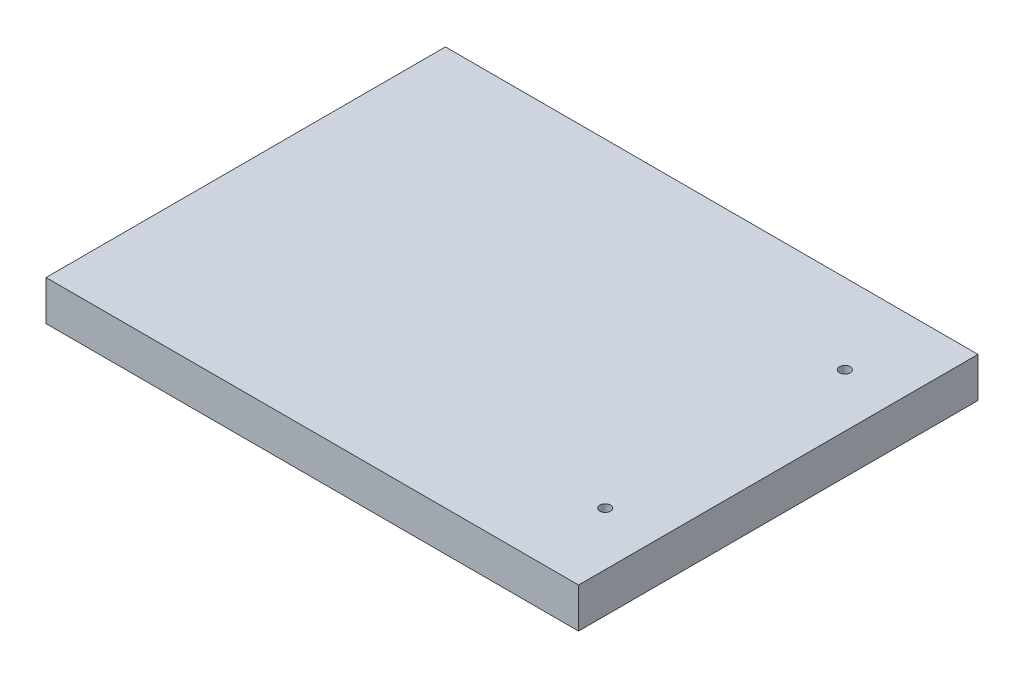
ISO-10303-21;
HEADER;
FILE_DESCRIPTION(('STEP AP214'),'2;1');
FILE_NAME('part.step','',(''),(''),'','','');
FILE_SCHEMA(('AUTOMOTIVE_DESIGN { 1 0 10303 214 1 1 1 1 }'));
ENDSEC;
DATA;
#1=APPLICATION_CONTEXT('core data for automotive mechanical design processes');
#2=APPLICATION_PROTOCOL_DEFINITION('international standard','automotive_design',2000,#1);
#3=PRODUCT_CONTEXT('',#1,'mechanical');
#4=PRODUCT('Part','Part','',(#3));
#5=PRODUCT_RELATED_PRODUCT_CATEGORY('part','',(#4));
#6=PRODUCT_DEFINITION_FORMATION('','',#4);
#7=PRODUCT_DEFINITION_CONTEXT('part definition',#1,'design');
#8=PRODUCT_DEFINITION('design','',#6,#7);
#9=PRODUCT_DEFINITION_SHAPE('','',#8);
#10=(LENGTH_UNIT() NAMED_UNIT(*) SI_UNIT(.MILLI.,.METRE.));
#11=(NAMED_UNIT(*) PLANE_ANGLE_UNIT() SI_UNIT($,.RADIAN.));
#12=(NAMED_UNIT(*) SI_UNIT($,.STERADIAN.) SOLID_ANGLE_UNIT());
#13=UNCERTAINTY_MEASURE_WITH_UNIT(LENGTH_MEASURE(1.E-05),#10,'distance_accuracy_value','');
#14=(GEOMETRIC_REPRESENTATION_CONTEXT(3) GLOBAL_UNCERTAINTY_ASSIGNED_CONTEXT((#13)) GLOBAL_UNIT_ASSIGNED_CONTEXT((#10,
#11,#12)) REPRESENTATION_CONTEXT('',''));
#15=CARTESIAN_POINT('',(0.,0.,0.));
#16=DIRECTION('',(0.,0.,1.));
#17=DIRECTION('',(1.,0.,0.));
#18=AXIS2_PLACEMENT_3D('',#15,#16,#17);
#19=CARTESIAN_POINT('',(0.,15.,0.));
#20=DIRECTION('',(1.,0.,0.));
#21=DIRECTION('',(0.,0.,-1.));
#22=AXIS2_PLACEMENT_3D('',#19,#20,#21);
#23=PLANE('',#22);
#24=DIRECTION('',(0.,0.,1.));
#25=VECTOR('',#24,1.);
#26=CARTESIAN_POINT('',(0.,0.,0.));
#27=LINE('',#26,#25);
#28=CARTESIAN_POINT('',(0.,0.,-150.));
#29=VERTEX_POINT('',#28);
#30=CARTESIAN_POINT('',(0.,0.,0.));
#31=VERTEX_POINT('',#30);
#32=EDGE_CURVE('E114',#29,#31,#27,.T.);
#33=ORIENTED_EDGE('',*,*,#32,.T.);
#34=DIRECTION('',(0.,-1.,0.));
#35=VECTOR('',#34,1.);
#36=CARTESIAN_POINT('',(0.,15.,0.));
#37=LINE('',#36,#35);
#38=CARTESIAN_POINT('',(0.,15.,0.));
#39=VERTEX_POINT('',#38);
#40=EDGE_CURVE('E11',#39,#31,#37,.T.);
#41=ORIENTED_EDGE('',*,*,#40,.F.);
#42=DIRECTION('',(0.,0.,1.));
#43=VECTOR('',#42,1.);
#44=CARTESIAN_POINT('',(0.,15.,0.));
#45=LINE('',#44,#43);
#46=CARTESIAN_POINT('',(0.,15.,-150.));
#47=VERTEX_POINT('',#46);
#48=EDGE_CURVE('E115',#47,#39,#45,.T.);
#49=ORIENTED_EDGE('',*,*,#48,.F.);
#50=DIRECTION('',(0.,-1.,0.));
#51=VECTOR('',#50,1.);
#52=CARTESIAN_POINT('',(0.,15.,-150.));
#53=LINE('',#52,#51);
#54=EDGE_CURVE('E121',#47,#29,#53,.T.);
#55=ORIENTED_EDGE('',*,*,#54,.T.);
#56=EDGE_LOOP('',(#33,#41,#49,#55));
#57=FACE_BOUND('',#56,.T.);
#58=ADVANCED_FACE('F39',(#57),#23,.F.);
#59=CARTESIAN_POINT('',(0.,15.,0.));
#60=DIRECTION('',(0.,0.,-1.));
#61=DIRECTION('',(-1.,0.,0.));
#62=AXIS2_PLACEMENT_3D('',#59,#60,#61);
#63=PLANE('',#62);
#64=DIRECTION('',(1.,0.,0.));
#65=VECTOR('',#64,1.);
#66=CARTESIAN_POINT('',(0.,0.,0.));
#67=LINE('',#66,#65);
#68=CARTESIAN_POINT('',(200.,0.,0.));
#69=VERTEX_POINT('',#68);
#70=EDGE_CURVE('E124',#31,#69,#67,.T.);
#71=ORIENTED_EDGE('',*,*,#70,.T.);
#72=DIRECTION('',(0.,-1.,0.));
#73=VECTOR('',#72,1.);
#74=CARTESIAN_POINT('',(200.,15.,0.));
#75=LINE('',#74,#73);
#76=CARTESIAN_POINT('',(200.,15.,0.));
#77=VERTEX_POINT('',#76);
#78=EDGE_CURVE('E47',#77,#69,#75,.T.);
#79=ORIENTED_EDGE('',*,*,#78,.F.);
#80=DIRECTION('',(1.,0.,0.));
#81=VECTOR('',#80,1.);
#82=CARTESIAN_POINT('',(0.,15.,0.));
#83=LINE('',#82,#81);
#84=EDGE_CURVE('E86',#39,#77,#83,.T.);
#85=ORIENTED_EDGE('',*,*,#84,.F.);
#86=ORIENTED_EDGE('',*,*,#40,.T.);
#87=EDGE_LOOP('',(#71,#79,#85,#86));
#88=FACE_BOUND('',#87,.T.);
#89=ADVANCED_FACE('F149',(#88),#63,.F.);
#90=CARTESIAN_POINT('',(200.,15.,0.));
#91=DIRECTION('',(-1.,0.,0.));
#92=DIRECTION('',(0.,0.,1.));
#93=AXIS2_PLACEMENT_3D('',#90,#91,#92);
#94=PLANE('',#93);
#95=DIRECTION('',(0.,0.,-1.));
#96=VECTOR('',#95,1.);
#97=CARTESIAN_POINT('',(200.,0.,0.));
#98=LINE('',#97,#96);
#99=CARTESIAN_POINT('',(200.,0.,-150.));
#100=VERTEX_POINT('',#99);
#101=EDGE_CURVE('E73',#69,#100,#98,.T.);
#102=ORIENTED_EDGE('',*,*,#101,.T.);
#103=DIRECTION('',(0.,-1.,0.));
#104=VECTOR('',#103,1.);
#105=CARTESIAN_POINT('',(200.,15.,-150.));
#106=LINE('',#105,#104);
#107=CARTESIAN_POINT('',(200.,15.,-150.));
#108=VERTEX_POINT('',#107);
#109=EDGE_CURVE('E129',#108,#100,#106,.T.);
#110=ORIENTED_EDGE('',*,*,#109,.F.);
#111=DIRECTION('',(0.,0.,-1.));
#112=VECTOR('',#111,1.);
#113=CARTESIAN_POINT('',(200.,15.,0.));
#114=LINE('',#113,#112);
#115=EDGE_CURVE('E118',#77,#108,#114,.T.);
#116=ORIENTED_EDGE('',*,*,#115,.F.);
#117=ORIENTED_EDGE('',*,*,#78,.T.);
#118=EDGE_LOOP('',(#102,#110,#116,#117));
#119=FACE_BOUND('',#118,.T.);
#120=ADVANCED_FACE('F131',(#119),#94,.F.);
#121=CARTESIAN_POINT('',(0.,15.,-150.));
#122=DIRECTION('',(0.,0.,1.));
#123=DIRECTION('',(1.,0.,0.));
#124=AXIS2_PLACEMENT_3D('',#121,#122,#123);
#125=PLANE('',#124);
#126=DIRECTION('',(-1.,0.,0.));
#127=VECTOR('',#126,1.);
#128=CARTESIAN_POINT('',(0.,0.,-150.));
#129=LINE('',#128,#127);
#130=EDGE_CURVE('E79',#100,#29,#129,.T.);
#131=ORIENTED_EDGE('',*,*,#130,.T.);
#132=ORIENTED_EDGE('',*,*,#54,.F.);
#133=DIRECTION('',(-1.,0.,0.));
#134=VECTOR('',#133,1.);
#135=CARTESIAN_POINT('',(0.,15.,-150.));
#136=LINE('',#135,#134);
#137=EDGE_CURVE('E55',#108,#47,#136,.T.);
#138=ORIENTED_EDGE('',*,*,#137,.F.);
#139=ORIENTED_EDGE('',*,*,#109,.T.);
#140=EDGE_LOOP('',(#131,#132,#138,#139));
#141=FACE_BOUND('',#140,.T.);
#142=ADVANCED_FACE('F138',(#141),#125,.F.);
#143=CARTESIAN_POINT('',(0.,15.,0.));
#144=DIRECTION('',(0.,-1.,0.));
#145=DIRECTION('',(0.,0.,-1.));
#146=AXIS2_PLACEMENT_3D('',#143,#144,#145);
#147=PLANE('',#146);
#148=CARTESIAN_POINT('',(180.,15.,-120.));
#149=DIRECTION('',(0.,1.,0.));
#150=DIRECTION('',(0.,0.,1.));
#151=AXIS2_PLACEMENT_3D('',#148,#149,#150);
#152=CIRCLE('',#151,2.);
#153=CARTESIAN_POINT('',(180.,15.,-118.));
#154=VERTEX_POINT('',#153);
#155=EDGE_CURVE('E104',#154,#154,#152,.T.);
#156=ORIENTED_EDGE('',*,*,#155,.F.);
#157=EDGE_LOOP('',(#156));
#158=FACE_BOUND('',#157,.T.);
#159=CARTESIAN_POINT('',(180.,15.,-30.));
#160=DIRECTION('',(0.,1.,0.));
#161=DIRECTION('',(0.,0.,1.));
#162=AXIS2_PLACEMENT_3D('',#159,#160,#161);
#163=CIRCLE('',#162,2.);
#164=CARTESIAN_POINT('',(180.,15.,-28.));
#165=VERTEX_POINT('',#164);
#166=EDGE_CURVE('E103',#165,#165,#163,.T.);
#167=ORIENTED_EDGE('',*,*,#166,.F.);
#168=EDGE_LOOP('',(#167));
#169=FACE_BOUND('',#168,.T.);
#170=ORIENTED_EDGE('',*,*,#48,.T.);
#171=ORIENTED_EDGE('',*,*,#84,.T.);
#172=ORIENTED_EDGE('',*,*,#115,.T.);
#173=ORIENTED_EDGE('',*,*,#137,.T.);
#174=EDGE_LOOP('',(#170,#171,#172,#173));
#175=FACE_BOUND('',#174,.T.);
#176=ADVANCED_FACE('F140',(#158,#169,#175),#147,.F.);
#177=CARTESIAN_POINT('',(0.,0.,0.));
#178=DIRECTION('',(0.,-1.,0.));
#179=DIRECTION('',(0.,0.,-1.));
#180=AXIS2_PLACEMENT_3D('',#177,#178,#179);
#181=PLANE('',#180);
#182=ORIENTED_EDGE('',*,*,#32,.F.);
#183=ORIENTED_EDGE('',*,*,#130,.F.);
#184=ORIENTED_EDGE('',*,*,#101,.F.);
#185=ORIENTED_EDGE('',*,*,#70,.F.);
#186=EDGE_LOOP('',(#182,#183,#184,#185));
#187=FACE_BOUND('',#186,.T.);
#188=ADVANCED_FACE('F134',(#187),#181,.T.);
#189=CARTESIAN_POINT('',(180.,9.5,-30.));
#190=DIRECTION('',(0.,1.,0.));
#191=DIRECTION('',(0.,0.,1.));
#192=AXIS2_PLACEMENT_3D('',#189,#190,#191);
#193=CONICAL_SURFACE('',#192,2.,1.02974425867665);
#194=CARTESIAN_POINT('',(180.,8.29827876194488,-30.));
#195=VERTEX_POINT('',#194);
#196=VERTEX_LOOP('',#195);
#197=FACE_BOUND('',#196,.T.);
#198=CARTESIAN_POINT('',(180.,9.5,-30.));
#199=DIRECTION('',(0.,1.,0.));
#200=DIRECTION('',(0.,0.,1.));
#201=AXIS2_PLACEMENT_3D('',#198,#199,#200);
#202=CIRCLE('',#201,2.);
#203=CARTESIAN_POINT('',(180.,9.5,-28.));
#204=VERTEX_POINT('',#203);
#205=EDGE_CURVE('E107',#204,#204,#202,.T.);
#206=ORIENTED_EDGE('',*,*,#205,.T.);
#207=EDGE_LOOP('',(#206));
#208=FACE_BOUND('',#207,.T.);
#209=ADVANCED_FACE('F183',(#197,#208),#193,.F.);
#210=CARTESIAN_POINT('',(180.,15.,-30.));
#211=DIRECTION('',(0.,1.,0.));
#212=DIRECTION('',(0.,0.,1.));
#213=AXIS2_PLACEMENT_3D('',#210,#211,#212);
#214=CYLINDRICAL_SURFACE('',#213,2.);
#215=ORIENTED_EDGE('',*,*,#205,.F.);
#216=EDGE_LOOP('',(#215));
#217=FACE_BOUND('',#216,.T.);
#218=ORIENTED_EDGE('',*,*,#166,.T.);
#219=EDGE_LOOP('',(#218));
#220=FACE_BOUND('',#219,.T.);
#221=ADVANCED_FACE('F97',(#217,#220),#214,.F.);
#222=CARTESIAN_POINT('',(180.,9.5,-120.));
#223=DIRECTION('',(0.,1.,0.));
#224=DIRECTION('',(0.,0.,1.));
#225=AXIS2_PLACEMENT_3D('',#222,#223,#224);
#226=CONICAL_SURFACE('',#225,2.,1.02974425867665);
#227=CARTESIAN_POINT('',(180.,8.29827876194488,-120.));
#228=VERTEX_POINT('',#227);
#229=VERTEX_LOOP('',#228);
#230=FACE_BOUND('',#229,.T.);
#231=CARTESIAN_POINT('',(180.,9.5,-120.));
#232=DIRECTION('',(0.,1.,0.));
#233=DIRECTION('',(0.,0.,1.));
#234=AXIS2_PLACEMENT_3D('',#231,#232,#233);
#235=CIRCLE('',#234,2.);
#236=CARTESIAN_POINT('',(180.,9.5,-118.));
#237=VERTEX_POINT('',#236);
#238=EDGE_CURVE('E101',#237,#237,#235,.T.);
#239=ORIENTED_EDGE('',*,*,#238,.T.);
#240=EDGE_LOOP('',(#239));
#241=FACE_BOUND('',#240,.T.);
#242=ADVANCED_FACE('F93',(#230,#241),#226,.F.);
#243=CARTESIAN_POINT('',(180.,15.,-120.));
#244=DIRECTION('',(0.,1.,0.));
#245=DIRECTION('',(0.,0.,1.));
#246=AXIS2_PLACEMENT_3D('',#243,#244,#245);
#247=CYLINDRICAL_SURFACE('',#246,2.);
#248=ORIENTED_EDGE('',*,*,#238,.F.);
#249=EDGE_LOOP('',(#248));
#250=FACE_BOUND('',#249,.T.);
#251=ORIENTED_EDGE('',*,*,#155,.T.);
#252=EDGE_LOOP('',(#251));
#253=FACE_BOUND('',#252,.T.);
#254=ADVANCED_FACE('F96',(#250,#253),#247,.F.);
#255=CLOSED_SHELL('',(#58,#89,#120,#142,#176,#188,#209,#221,#242,#254));
#256=MANIFOLD_SOLID_BREP('B2',#255);
#257=ADVANCED_BREP_SHAPE_REPRESENTATION('',(#18,#256),#14);
#258=SHAPE_DEFINITION_REPRESENTATION(#9,#257);
ENDSEC;
END-ISO-10303-21;
